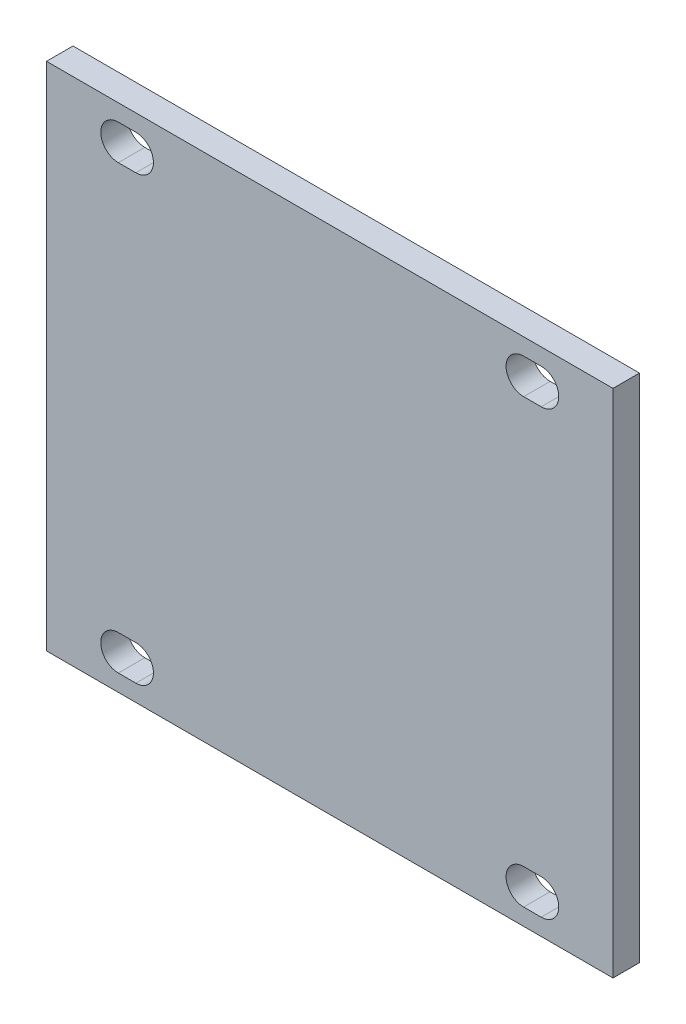
ISO-10303-21;
HEADER;
FILE_DESCRIPTION(('STEP AP214'),'2;1');
FILE_NAME('part.step','',(''),(''),'','','');
FILE_SCHEMA(('AUTOMOTIVE_DESIGN { 1 0 10303 214 1 1 1 1 }'));
ENDSEC;
DATA;
#1=APPLICATION_CONTEXT('core data for automotive mechanical design processes');
#2=APPLICATION_PROTOCOL_DEFINITION('international standard','automotive_design',2000,#1);
#3=PRODUCT_CONTEXT('',#1,'mechanical');
#4=PRODUCT('Part','Part','',(#3));
#5=PRODUCT_RELATED_PRODUCT_CATEGORY('part','',(#4));
#6=PRODUCT_DEFINITION_FORMATION('','',#4);
#7=PRODUCT_DEFINITION_CONTEXT('part definition',#1,'design');
#8=PRODUCT_DEFINITION('design','',#6,#7);
#9=PRODUCT_DEFINITION_SHAPE('','',#8);
#10=(LENGTH_UNIT() NAMED_UNIT(*) SI_UNIT(.MILLI.,.METRE.));
#11=(NAMED_UNIT(*) PLANE_ANGLE_UNIT() SI_UNIT($,.RADIAN.));
#12=(NAMED_UNIT(*) SI_UNIT($,.STERADIAN.) SOLID_ANGLE_UNIT());
#13=UNCERTAINTY_MEASURE_WITH_UNIT(LENGTH_MEASURE(1.E-05),#10,'distance_accuracy_value','');
#14=(GEOMETRIC_REPRESENTATION_CONTEXT(3) GLOBAL_UNCERTAINTY_ASSIGNED_CONTEXT((#13)) GLOBAL_UNIT_ASSIGNED_CONTEXT((#10,
#11,#12)) REPRESENTATION_CONTEXT('',''));
#15=CARTESIAN_POINT('',(0.,0.,0.));
#16=DIRECTION('',(0.,0.,1.));
#17=DIRECTION('',(1.,0.,0.));
#18=AXIS2_PLACEMENT_3D('',#15,#16,#17);
#19=CARTESIAN_POINT('',(0.,0.,0.));
#20=DIRECTION('',(0.,0.,-1.));
#21=DIRECTION('',(-1.,0.,0.));
#22=AXIS2_PLACEMENT_3D('',#19,#20,#21);
#23=PLANE('',#22);
#24=DIRECTION('',(0.,-1.,0.));
#25=VECTOR('',#24,1.);
#26=CARTESIAN_POINT('',(0.,0.,0.));
#27=LINE('',#26,#25);
#28=CARTESIAN_POINT('',(0.,32.,0.));
#29=VERTEX_POINT('',#28);
#30=CARTESIAN_POINT('',(0.,0.,0.));
#31=VERTEX_POINT('',#30);
#32=EDGE_CURVE('E366',#29,#31,#27,.T.);
#33=ORIENTED_EDGE('',*,*,#32,.F.);
#34=DIRECTION('',(-1.,0.,0.));
#35=VECTOR('',#34,1.);
#36=CARTESIAN_POINT('',(0.,32.,0.));
#37=LINE('',#36,#35);
#38=CARTESIAN_POINT('',(35.5,32.,0.));
#39=VERTEX_POINT('',#38);
#40=EDGE_CURVE('E373',#39,#29,#37,.T.);
#41=ORIENTED_EDGE('',*,*,#40,.F.);
#42=DIRECTION('',(0.,1.,0.));
#43=VECTOR('',#42,1.);
#44=CARTESIAN_POINT('',(35.5,0.,0.));
#45=LINE('',#44,#43);
#46=CARTESIAN_POINT('',(35.5,0.,0.));
#47=VERTEX_POINT('',#46);
#48=EDGE_CURVE('E383',#47,#39,#45,.T.);
#49=ORIENTED_EDGE('',*,*,#48,.F.);
#50=DIRECTION('',(1.,0.,0.));
#51=VECTOR('',#50,1.);
#52=CARTESIAN_POINT('',(0.,0.,0.));
#53=LINE('',#52,#51);
#54=EDGE_CURVE('E385',#31,#47,#53,.T.);
#55=ORIENTED_EDGE('',*,*,#54,.F.);
#56=EDGE_LOOP('',(#33,#41,#49,#55));
#57=FACE_BOUND('',#56,.T.);
#58=DIRECTION('',(-1.,0.,0.));
#59=VECTOR('',#58,1.);
#60=CARTESIAN_POINT('',(4.5,30.95,0.));
#61=LINE('',#60,#59);
#62=CARTESIAN_POINT('',(5.6,30.95,0.));
#63=VERTEX_POINT('',#62);
#64=CARTESIAN_POINT('',(4.5,30.95,0.));
#65=VERTEX_POINT('',#64);
#66=EDGE_CURVE('E342',#63,#65,#61,.T.);
#67=ORIENTED_EDGE('',*,*,#66,.T.);
#68=CARTESIAN_POINT('',(4.5,29.85,0.));
#69=DIRECTION('',(0.,0.,1.));
#70=DIRECTION('',(1.,0.,0.));
#71=AXIS2_PLACEMENT_3D('',#68,#69,#70);
#72=CIRCLE('',#71,1.1);
#73=CARTESIAN_POINT('',(4.5,28.75,0.));
#74=VERTEX_POINT('',#73);
#75=EDGE_CURVE('E340',#65,#74,#72,.T.);
#76=ORIENTED_EDGE('',*,*,#75,.T.);
#77=DIRECTION('',(1.,0.,0.));
#78=VECTOR('',#77,1.);
#79=CARTESIAN_POINT('',(4.5,28.75,0.));
#80=LINE('',#79,#78);
#81=CARTESIAN_POINT('',(5.6,28.75,0.));
#82=VERTEX_POINT('',#81);
#83=EDGE_CURVE('E352',#74,#82,#80,.T.);
#84=ORIENTED_EDGE('',*,*,#83,.T.);
#85=CARTESIAN_POINT('',(5.6,29.85,0.));
#86=DIRECTION('',(0.,0.,1.));
#87=DIRECTION('',(1.,0.,0.));
#88=AXIS2_PLACEMENT_3D('',#85,#86,#87);
#89=CIRCLE('',#88,1.1);
#90=EDGE_CURVE('E351',#82,#63,#89,.T.);
#91=ORIENTED_EDGE('',*,*,#90,.T.);
#92=EDGE_LOOP('',(#67,#76,#84,#91));
#93=FACE_BOUND('',#92,.T.);
#94=DIRECTION('',(-1.,0.,0.));
#95=VECTOR('',#94,1.);
#96=CARTESIAN_POINT('',(29.9,30.95,0.));
#97=LINE('',#96,#95);
#98=CARTESIAN_POINT('',(31.,30.95,0.));
#99=VERTEX_POINT('',#98);
#100=CARTESIAN_POINT('',(29.9,30.95,0.));
#101=VERTEX_POINT('',#100);
#102=EDGE_CURVE('E309',#99,#101,#97,.T.);
#103=ORIENTED_EDGE('',*,*,#102,.T.);
#104=CARTESIAN_POINT('',(29.9,29.85,0.));
#105=DIRECTION('',(0.,0.,1.));
#106=DIRECTION('',(1.,0.,0.));
#107=AXIS2_PLACEMENT_3D('',#104,#105,#106);
#108=CIRCLE('',#107,1.1);
#109=CARTESIAN_POINT('',(29.9,28.75,0.));
#110=VERTEX_POINT('',#109);
#111=EDGE_CURVE('E308',#101,#110,#108,.T.);
#112=ORIENTED_EDGE('',*,*,#111,.T.);
#113=DIRECTION('',(1.,0.,0.));
#114=VECTOR('',#113,1.);
#115=CARTESIAN_POINT('',(29.9,28.75,0.));
#116=LINE('',#115,#114);
#117=CARTESIAN_POINT('',(31.,28.75,0.));
#118=VERTEX_POINT('',#117);
#119=EDGE_CURVE('E319',#110,#118,#116,.T.);
#120=ORIENTED_EDGE('',*,*,#119,.T.);
#121=CARTESIAN_POINT('',(31.,29.85,0.));
#122=DIRECTION('',(0.,0.,1.));
#123=DIRECTION('',(1.,0.,0.));
#124=AXIS2_PLACEMENT_3D('',#121,#122,#123);
#125=CIRCLE('',#124,1.1);
#126=EDGE_CURVE('E323',#118,#99,#125,.T.);
#127=ORIENTED_EDGE('',*,*,#126,.T.);
#128=EDGE_LOOP('',(#103,#112,#120,#127));
#129=FACE_BOUND('',#128,.T.);
#130=DIRECTION('',(-1.,0.,0.));
#131=VECTOR('',#130,1.);
#132=CARTESIAN_POINT('',(29.9000000000003,3.25,0.));
#133=LINE('',#132,#131);
#134=CARTESIAN_POINT('',(31.0000000000003,3.25,0.));
#135=VERTEX_POINT('',#134);
#136=CARTESIAN_POINT('',(29.9000000000003,3.25,0.));
#137=VERTEX_POINT('',#136);
#138=EDGE_CURVE('E276',#135,#137,#133,.T.);
#139=ORIENTED_EDGE('',*,*,#138,.T.);
#140=CARTESIAN_POINT('',(29.9000000000003,2.15,0.));
#141=DIRECTION('',(0.,0.,1.));
#142=DIRECTION('',(1.,0.,0.));
#143=AXIS2_PLACEMENT_3D('',#140,#141,#142);
#144=CIRCLE('',#143,1.1);
#145=CARTESIAN_POINT('',(29.9000000000003,1.05,0.));
#146=VERTEX_POINT('',#145);
#147=EDGE_CURVE('E274',#137,#146,#144,.T.);
#148=ORIENTED_EDGE('',*,*,#147,.T.);
#149=DIRECTION('',(1.,0.,0.));
#150=VECTOR('',#149,1.);
#151=CARTESIAN_POINT('',(29.9000000000003,1.05,0.));
#152=LINE('',#151,#150);
#153=CARTESIAN_POINT('',(31.0000000000003,1.05,0.));
#154=VERTEX_POINT('',#153);
#155=EDGE_CURVE('E286',#146,#154,#152,.T.);
#156=ORIENTED_EDGE('',*,*,#155,.T.);
#157=CARTESIAN_POINT('',(31.0000000000003,2.15,0.));
#158=DIRECTION('',(0.,0.,1.));
#159=DIRECTION('',(1.,0.,0.));
#160=AXIS2_PLACEMENT_3D('',#157,#158,#159);
#161=CIRCLE('',#160,1.1);
#162=EDGE_CURVE('E295',#154,#135,#161,.T.);
#163=ORIENTED_EDGE('',*,*,#162,.T.);
#164=EDGE_LOOP('',(#139,#148,#156,#163));
#165=FACE_BOUND('',#164,.T.);
#166=DIRECTION('',(-1.,0.,0.));
#167=VECTOR('',#166,1.);
#168=CARTESIAN_POINT('',(4.50000000000029,3.25,0.));
#169=LINE('',#168,#167);
#170=CARTESIAN_POINT('',(5.60000000000029,3.25,0.));
#171=VERTEX_POINT('',#170);
#172=CARTESIAN_POINT('',(4.50000000000029,3.25,0.));
#173=VERTEX_POINT('',#172);
#174=EDGE_CURVE('E248',#171,#173,#169,.T.);
#175=ORIENTED_EDGE('',*,*,#174,.T.);
#176=CARTESIAN_POINT('',(4.50000000000029,2.15,0.));
#177=DIRECTION('',(0.,0.,1.));
#178=DIRECTION('',(1.,0.,0.));
#179=AXIS2_PLACEMENT_3D('',#176,#177,#178);
#180=CIRCLE('',#179,1.1);
#181=CARTESIAN_POINT('',(4.50000000000029,1.05,0.));
#182=VERTEX_POINT('',#181);
#183=EDGE_CURVE('E244',#173,#182,#180,.T.);
#184=ORIENTED_EDGE('',*,*,#183,.T.);
#185=DIRECTION('',(1.,0.,0.));
#186=VECTOR('',#185,1.);
#187=CARTESIAN_POINT('',(4.50000000000029,1.05,0.));
#188=LINE('',#187,#186);
#189=CARTESIAN_POINT('',(5.60000000000029,1.05,0.));
#190=VERTEX_POINT('',#189);
#191=EDGE_CURVE('E259',#182,#190,#188,.T.);
#192=ORIENTED_EDGE('',*,*,#191,.T.);
#193=CARTESIAN_POINT('',(5.60000000000029,2.15,0.));
#194=DIRECTION('',(0.,0.,1.));
#195=DIRECTION('',(1.,0.,0.));
#196=AXIS2_PLACEMENT_3D('',#193,#194,#195);
#197=CIRCLE('',#196,1.1);
#198=EDGE_CURVE('E265',#190,#171,#197,.T.);
#199=ORIENTED_EDGE('',*,*,#198,.T.);
#200=EDGE_LOOP('',(#175,#184,#192,#199));
#201=FACE_BOUND('',#200,.T.);
#202=DIRECTION('',(1.,0.,0.));
#203=VECTOR('',#202,1.);
#204=CARTESIAN_POINT('',(33.41,10.24,0.));
#205=LINE('',#204,#203);
#206=CARTESIAN_POINT('',(2.09,10.24,0.));
#207=VERTEX_POINT('',#206);
#208=CARTESIAN_POINT('',(33.41,10.24,0.));
#209=VERTEX_POINT('',#208);
#210=EDGE_CURVE('E228',#207,#209,#205,.T.);
#211=ORIENTED_EDGE('',*,*,#210,.T.);
#212=DIRECTION('',(0.,1.,0.));
#213=VECTOR('',#212,1.);
#214=CARTESIAN_POINT('',(33.41,25.86,0.));
#215=LINE('',#214,#213);
#216=CARTESIAN_POINT('',(33.41,25.86,0.));
#217=VERTEX_POINT('',#216);
#218=EDGE_CURVE('E65',#209,#217,#215,.T.);
#219=ORIENTED_EDGE('',*,*,#218,.T.);
#220=DIRECTION('',(-1.,0.,0.));
#221=VECTOR('',#220,1.);
#222=CARTESIAN_POINT('',(33.41,25.86,0.));
#223=LINE('',#222,#221);
#224=CARTESIAN_POINT('',(2.08999999999999,25.86,0.));
#225=VERTEX_POINT('',#224);
#226=EDGE_CURVE('E213',#217,#225,#223,.T.);
#227=ORIENTED_EDGE('',*,*,#226,.T.);
#228=DIRECTION('',(0.,-1.,0.));
#229=VECTOR('',#228,1.);
#230=CARTESIAN_POINT('',(2.08999999999999,25.86,0.));
#231=LINE('',#230,#229);
#232=EDGE_CURVE('E234',#225,#207,#231,.T.);
#233=ORIENTED_EDGE('',*,*,#232,.T.);
#234=EDGE_LOOP('',(#211,#219,#227,#233));
#235=FACE_BOUND('',#234,.T.);
#236=ADVANCED_FACE('F50',(#57,#93,#129,#165,#201,#235),#23,.T.);
#237=CARTESIAN_POINT('',(0.,0.,1.66));
#238=DIRECTION('',(0.,0.,-1.));
#239=DIRECTION('',(-1.,0.,0.));
#240=AXIS2_PLACEMENT_3D('',#237,#238,#239);
#241=PLANE('',#240);
#242=CARTESIAN_POINT('',(29.9000000000003,2.15,1.66));
#243=DIRECTION('',(0.,0.,1.));
#244=DIRECTION('',(1.,0.,0.));
#245=AXIS2_PLACEMENT_3D('',#242,#243,#244);
#246=CIRCLE('',#245,1.1);
#247=CARTESIAN_POINT('',(29.9000000000003,3.25,1.66));
#248=VERTEX_POINT('',#247);
#249=CARTESIAN_POINT('',(29.9000000000003,1.05,1.66));
#250=VERTEX_POINT('',#249);
#251=EDGE_CURVE('E277',#248,#250,#246,.T.);
#252=ORIENTED_EDGE('',*,*,#251,.F.);
#253=DIRECTION('',(-1.,0.,0.));
#254=VECTOR('',#253,1.);
#255=CARTESIAN_POINT('',(29.9000000000003,3.25,1.66));
#256=LINE('',#255,#254);
#257=CARTESIAN_POINT('',(31.0000000000003,3.25,1.66));
#258=VERTEX_POINT('',#257);
#259=EDGE_CURVE('E281',#258,#248,#256,.T.);
#260=ORIENTED_EDGE('',*,*,#259,.F.);
#261=CARTESIAN_POINT('',(31.0000000000003,2.15,1.66));
#262=DIRECTION('',(0.,0.,1.));
#263=DIRECTION('',(1.,0.,0.));
#264=AXIS2_PLACEMENT_3D('',#261,#262,#263);
#265=CIRCLE('',#264,1.1);
#266=CARTESIAN_POINT('',(31.0000000000003,1.05,1.66));
#267=VERTEX_POINT('',#266);
#268=EDGE_CURVE('E282',#267,#258,#265,.T.);
#269=ORIENTED_EDGE('',*,*,#268,.F.);
#270=DIRECTION('',(1.,0.,0.));
#271=VECTOR('',#270,1.);
#272=CARTESIAN_POINT('',(29.9000000000003,1.05,1.66));
#273=LINE('',#272,#271);
#274=EDGE_CURVE('E279',#250,#267,#273,.T.);
#275=ORIENTED_EDGE('',*,*,#274,.F.);
#276=EDGE_LOOP('',(#252,#260,#269,#275));
#277=FACE_BOUND('',#276,.T.);
#278=CARTESIAN_POINT('',(4.5,29.85,1.66));
#279=DIRECTION('',(0.,0.,1.));
#280=DIRECTION('',(1.,0.,0.));
#281=AXIS2_PLACEMENT_3D('',#278,#279,#280);
#282=CIRCLE('',#281,1.1);
#283=CARTESIAN_POINT('',(4.5,30.95,1.66));
#284=VERTEX_POINT('',#283);
#285=CARTESIAN_POINT('',(4.5,28.75,1.66));
#286=VERTEX_POINT('',#285);
#287=EDGE_CURVE('E339',#284,#286,#282,.T.);
#288=ORIENTED_EDGE('',*,*,#287,.F.);
#289=DIRECTION('',(-1.,0.,0.));
#290=VECTOR('',#289,1.);
#291=CARTESIAN_POINT('',(4.5,30.95,1.66));
#292=LINE('',#291,#290);
#293=CARTESIAN_POINT('',(5.6,30.95,1.66));
#294=VERTEX_POINT('',#293);
#295=EDGE_CURVE('E347',#294,#284,#292,.T.);
#296=ORIENTED_EDGE('',*,*,#295,.F.);
#297=CARTESIAN_POINT('',(5.6,29.85,1.66));
#298=DIRECTION('',(0.,0.,1.));
#299=DIRECTION('',(1.,0.,0.));
#300=AXIS2_PLACEMENT_3D('',#297,#298,#299);
#301=CIRCLE('',#300,1.1);
#302=CARTESIAN_POINT('',(5.6,28.75,1.66));
#303=VERTEX_POINT('',#302);
#304=EDGE_CURVE('E344',#303,#294,#301,.T.);
#305=ORIENTED_EDGE('',*,*,#304,.F.);
#306=DIRECTION('',(1.,0.,0.));
#307=VECTOR('',#306,1.);
#308=CARTESIAN_POINT('',(4.5,28.75,1.66));
#309=LINE('',#308,#307);
#310=EDGE_CURVE('E338',#286,#303,#309,.T.);
#311=ORIENTED_EDGE('',*,*,#310,.F.);
#312=EDGE_LOOP('',(#288,#296,#305,#311));
#313=FACE_BOUND('',#312,.T.);
#314=DIRECTION('',(0.,-1.,0.));
#315=VECTOR('',#314,1.);
#316=CARTESIAN_POINT('',(0.,0.,1.66));
#317=LINE('',#316,#315);
#318=CARTESIAN_POINT('',(0.,32.,1.66));
#319=VERTEX_POINT('',#318);
#320=CARTESIAN_POINT('',(0.,0.,1.66));
#321=VERTEX_POINT('',#320);
#322=EDGE_CURVE('E369',#319,#321,#317,.T.);
#323=ORIENTED_EDGE('',*,*,#322,.T.);
#324=DIRECTION('',(1.,0.,0.));
#325=VECTOR('',#324,1.);
#326=CARTESIAN_POINT('',(0.,0.,1.66));
#327=LINE('',#326,#325);
#328=CARTESIAN_POINT('',(35.5,0.,1.66));
#329=VERTEX_POINT('',#328);
#330=EDGE_CURVE('E375',#321,#329,#327,.T.);
#331=ORIENTED_EDGE('',*,*,#330,.T.);
#332=DIRECTION('',(0.,1.,0.));
#333=VECTOR('',#332,1.);
#334=CARTESIAN_POINT('',(35.5,0.,1.66));
#335=LINE('',#334,#333);
#336=CARTESIAN_POINT('',(35.5,32.,1.66));
#337=VERTEX_POINT('',#336);
#338=EDGE_CURVE('E374',#329,#337,#335,.T.);
#339=ORIENTED_EDGE('',*,*,#338,.T.);
#340=DIRECTION('',(-1.,0.,0.));
#341=VECTOR('',#340,1.);
#342=CARTESIAN_POINT('',(0.,32.,1.66));
#343=LINE('',#342,#341);
#344=EDGE_CURVE('E380',#337,#319,#343,.T.);
#345=ORIENTED_EDGE('',*,*,#344,.T.);
#346=EDGE_LOOP('',(#323,#331,#339,#345));
#347=FACE_BOUND('',#346,.T.);
#348=CARTESIAN_POINT('',(29.9,29.85,1.66));
#349=DIRECTION('',(0.,0.,1.));
#350=DIRECTION('',(1.,0.,0.));
#351=AXIS2_PLACEMENT_3D('',#348,#349,#350);
#352=CIRCLE('',#351,1.1);
#353=CARTESIAN_POINT('',(29.9,30.95,1.66));
#354=VERTEX_POINT('',#353);
#355=CARTESIAN_POINT('',(29.9,28.75,1.66));
#356=VERTEX_POINT('',#355);
#357=EDGE_CURVE('E307',#354,#356,#352,.T.);
#358=ORIENTED_EDGE('',*,*,#357,.F.);
#359=DIRECTION('',(-1.,0.,0.));
#360=VECTOR('',#359,1.);
#361=CARTESIAN_POINT('',(29.9,30.95,1.66));
#362=LINE('',#361,#360);
#363=CARTESIAN_POINT('',(31.,30.95,1.66));
#364=VERTEX_POINT('',#363);
#365=EDGE_CURVE('E312',#364,#354,#362,.T.);
#366=ORIENTED_EDGE('',*,*,#365,.F.);
#367=CARTESIAN_POINT('',(31.,29.85,1.66));
#368=DIRECTION('',(0.,0.,1.));
#369=DIRECTION('',(1.,0.,0.));
#370=AXIS2_PLACEMENT_3D('',#367,#368,#369);
#371=CIRCLE('',#370,1.1);
#372=CARTESIAN_POINT('',(31.,28.75,1.66));
#373=VERTEX_POINT('',#372);
#374=EDGE_CURVE('E315',#373,#364,#371,.T.);
#375=ORIENTED_EDGE('',*,*,#374,.F.);
#376=DIRECTION('',(1.,0.,0.));
#377=VECTOR('',#376,1.);
#378=CARTESIAN_POINT('',(29.9,28.75,1.66));
#379=LINE('',#378,#377);
#380=EDGE_CURVE('E310',#356,#373,#379,.T.);
#381=ORIENTED_EDGE('',*,*,#380,.F.);
#382=EDGE_LOOP('',(#358,#366,#375,#381));
#383=FACE_BOUND('',#382,.T.);
#384=CARTESIAN_POINT('',(4.50000000000029,2.15,1.66));
#385=DIRECTION('',(0.,0.,1.));
#386=DIRECTION('',(1.,0.,0.));
#387=AXIS2_PLACEMENT_3D('',#384,#385,#386);
#388=CIRCLE('',#387,1.1);
#389=CARTESIAN_POINT('',(4.50000000000029,3.25,1.66));
#390=VERTEX_POINT('',#389);
#391=CARTESIAN_POINT('',(4.50000000000029,1.05,1.66));
#392=VERTEX_POINT('',#391);
#393=EDGE_CURVE('E250',#390,#392,#388,.T.);
#394=ORIENTED_EDGE('',*,*,#393,.F.);
#395=DIRECTION('',(-1.,0.,0.));
#396=VECTOR('',#395,1.);
#397=CARTESIAN_POINT('',(4.50000000000029,3.25,1.66));
#398=LINE('',#397,#396);
#399=CARTESIAN_POINT('',(5.60000000000029,3.25,1.66));
#400=VERTEX_POINT('',#399);
#401=EDGE_CURVE('E255',#400,#390,#398,.T.);
#402=ORIENTED_EDGE('',*,*,#401,.F.);
#403=CARTESIAN_POINT('',(5.60000000000029,2.15,1.66));
#404=DIRECTION('',(0.,0.,1.));
#405=DIRECTION('',(1.,0.,0.));
#406=AXIS2_PLACEMENT_3D('',#403,#404,#405);
#407=CIRCLE('',#406,1.1);
#408=CARTESIAN_POINT('',(5.60000000000029,1.05,1.66));
#409=VERTEX_POINT('',#408);
#410=EDGE_CURVE('E252',#409,#400,#407,.T.);
#411=ORIENTED_EDGE('',*,*,#410,.F.);
#412=DIRECTION('',(1.,0.,0.));
#413=VECTOR('',#412,1.);
#414=CARTESIAN_POINT('',(4.50000000000029,1.05,1.66));
#415=LINE('',#414,#413);
#416=EDGE_CURVE('E246',#392,#409,#415,.T.);
#417=ORIENTED_EDGE('',*,*,#416,.F.);
#418=EDGE_LOOP('',(#394,#402,#411,#417));
#419=FACE_BOUND('',#418,.T.);
#420=ADVANCED_FACE('F412',(#277,#313,#347,#383,#419),#241,.F.);
#421=CARTESIAN_POINT('',(0.,0.,1.66));
#422=DIRECTION('',(1.,0.,0.));
#423=DIRECTION('',(0.,0.,-1.));
#424=AXIS2_PLACEMENT_3D('',#421,#422,#423);
#425=PLANE('',#424);
#426=ORIENTED_EDGE('',*,*,#32,.T.);
#427=DIRECTION('',(0.,0.,-1.));
#428=VECTOR('',#427,1.);
#429=CARTESIAN_POINT('',(0.,0.,1.66));
#430=LINE('',#429,#428);
#431=EDGE_CURVE('E11',#321,#31,#430,.T.);
#432=ORIENTED_EDGE('',*,*,#431,.F.);
#433=ORIENTED_EDGE('',*,*,#322,.F.);
#434=DIRECTION('',(0.,0.,-1.));
#435=VECTOR('',#434,1.);
#436=CARTESIAN_POINT('',(0.,32.,1.66));
#437=LINE('',#436,#435);
#438=EDGE_CURVE('E377',#319,#29,#437,.T.);
#439=ORIENTED_EDGE('',*,*,#438,.T.);
#440=EDGE_LOOP('',(#426,#432,#433,#439));
#441=FACE_BOUND('',#440,.T.);
#442=ADVANCED_FACE('F47',(#441),#425,.F.);
#443=CARTESIAN_POINT('',(0.,0.,1.66));
#444=DIRECTION('',(0.,1.,0.));
#445=DIRECTION('',(0.,0.,1.));
#446=AXIS2_PLACEMENT_3D('',#443,#444,#445);
#447=PLANE('',#446);
#448=ORIENTED_EDGE('',*,*,#54,.T.);
#449=DIRECTION('',(0.,0.,-1.));
#450=VECTOR('',#449,1.);
#451=CARTESIAN_POINT('',(35.5,0.,1.66));
#452=LINE('',#451,#450);
#453=EDGE_CURVE('E54',#329,#47,#452,.T.);
#454=ORIENTED_EDGE('',*,*,#453,.F.);
#455=ORIENTED_EDGE('',*,*,#330,.F.);
#456=ORIENTED_EDGE('',*,*,#431,.T.);
#457=EDGE_LOOP('',(#448,#454,#455,#456));
#458=FACE_BOUND('',#457,.T.);
#459=ADVANCED_FACE('F414',(#458),#447,.F.);
#460=CARTESIAN_POINT('',(35.5,0.,1.66));
#461=DIRECTION('',(-1.,0.,0.));
#462=DIRECTION('',(0.,0.,1.));
#463=AXIS2_PLACEMENT_3D('',#460,#461,#462);
#464=PLANE('',#463);
#465=ORIENTED_EDGE('',*,*,#48,.T.);
#466=DIRECTION('',(0.,0.,-1.));
#467=VECTOR('',#466,1.);
#468=CARTESIAN_POINT('',(35.5,32.,1.66));
#469=LINE('',#468,#467);
#470=EDGE_CURVE('E386',#337,#39,#469,.T.);
#471=ORIENTED_EDGE('',*,*,#470,.F.);
#472=ORIENTED_EDGE('',*,*,#338,.F.);
#473=ORIENTED_EDGE('',*,*,#453,.T.);
#474=EDGE_LOOP('',(#465,#471,#472,#473));
#475=FACE_BOUND('',#474,.T.);
#476=ADVANCED_FACE('F397',(#475),#464,.F.);
#477=CARTESIAN_POINT('',(0.,32.,1.66));
#478=DIRECTION('',(0.,-1.,0.));
#479=DIRECTION('',(0.,0.,-1.));
#480=AXIS2_PLACEMENT_3D('',#477,#478,#479);
#481=PLANE('',#480);
#482=ORIENTED_EDGE('',*,*,#40,.T.);
#483=ORIENTED_EDGE('',*,*,#438,.F.);
#484=ORIENTED_EDGE('',*,*,#344,.F.);
#485=ORIENTED_EDGE('',*,*,#470,.T.);
#486=EDGE_LOOP('',(#482,#483,#484,#485));
#487=FACE_BOUND('',#486,.T.);
#488=ADVANCED_FACE('F403',(#487),#481,.F.);
#489=CARTESIAN_POINT('',(4.5,29.85,1.66));
#490=DIRECTION('',(0.,0.,-1.));
#491=DIRECTION('',(-1.,0.,0.));
#492=AXIS2_PLACEMENT_3D('',#489,#490,#491);
#493=CYLINDRICAL_SURFACE('',#492,1.1);
#494=ORIENTED_EDGE('',*,*,#75,.F.);
#495=DIRECTION('',(0.,0.,-1.));
#496=VECTOR('',#495,1.);
#497=CARTESIAN_POINT('',(4.5,30.95,1.66));
#498=LINE('',#497,#496);
#499=EDGE_CURVE('E346',#284,#65,#498,.T.);
#500=ORIENTED_EDGE('',*,*,#499,.F.);
#501=ORIENTED_EDGE('',*,*,#287,.T.);
#502=DIRECTION('',(0.,0.,-1.));
#503=VECTOR('',#502,1.);
#504=CARTESIAN_POINT('',(4.5,28.75,1.66));
#505=LINE('',#504,#503);
#506=EDGE_CURVE('E364',#286,#74,#505,.T.);
#507=ORIENTED_EDGE('',*,*,#506,.T.);
#508=EDGE_LOOP('',(#494,#500,#501,#507));
#509=FACE_BOUND('',#508,.T.);
#510=ADVANCED_FACE('F435',(#509),#493,.F.);
#511=CARTESIAN_POINT('',(4.5,28.75,1.66));
#512=DIRECTION('',(0.,1.,0.));
#513=DIRECTION('',(0.,0.,1.));
#514=AXIS2_PLACEMENT_3D('',#511,#512,#513);
#515=PLANE('',#514);
#516=ORIENTED_EDGE('',*,*,#83,.F.);
#517=ORIENTED_EDGE('',*,*,#506,.F.);
#518=ORIENTED_EDGE('',*,*,#310,.T.);
#519=DIRECTION('',(0.,0.,-1.));
#520=VECTOR('',#519,1.);
#521=CARTESIAN_POINT('',(5.6,28.75,1.66));
#522=LINE('',#521,#520);
#523=EDGE_CURVE('E361',#303,#82,#522,.T.);
#524=ORIENTED_EDGE('',*,*,#523,.T.);
#525=EDGE_LOOP('',(#516,#517,#518,#524));
#526=FACE_BOUND('',#525,.T.);
#527=ADVANCED_FACE('F436',(#526),#515,.T.);
#528=CARTESIAN_POINT('',(5.6,29.85,1.66));
#529=DIRECTION('',(0.,0.,-1.));
#530=DIRECTION('',(-1.,0.,0.));
#531=AXIS2_PLACEMENT_3D('',#528,#529,#530);
#532=CYLINDRICAL_SURFACE('',#531,1.1);
#533=ORIENTED_EDGE('',*,*,#90,.F.);
#534=ORIENTED_EDGE('',*,*,#523,.F.);
#535=ORIENTED_EDGE('',*,*,#304,.T.);
#536=DIRECTION('',(0.,0.,-1.));
#537=VECTOR('',#536,1.);
#538=CARTESIAN_POINT('',(5.6,30.95,1.66));
#539=LINE('',#538,#537);
#540=EDGE_CURVE('E363',#294,#63,#539,.T.);
#541=ORIENTED_EDGE('',*,*,#540,.T.);
#542=EDGE_LOOP('',(#533,#534,#535,#541));
#543=FACE_BOUND('',#542,.T.);
#544=ADVANCED_FACE('F442',(#543),#532,.F.);
#545=CARTESIAN_POINT('',(4.5,30.95,1.66));
#546=DIRECTION('',(0.,-1.,0.));
#547=DIRECTION('',(0.,0.,-1.));
#548=AXIS2_PLACEMENT_3D('',#545,#546,#547);
#549=PLANE('',#548);
#550=ORIENTED_EDGE('',*,*,#66,.F.);
#551=ORIENTED_EDGE('',*,*,#540,.F.);
#552=ORIENTED_EDGE('',*,*,#295,.T.);
#553=ORIENTED_EDGE('',*,*,#499,.T.);
#554=EDGE_LOOP('',(#550,#551,#552,#553));
#555=FACE_BOUND('',#554,.T.);
#556=ADVANCED_FACE('F450',(#555),#549,.T.);
#557=CARTESIAN_POINT('',(29.9,29.85,1.66));
#558=DIRECTION('',(0.,0.,-1.));
#559=DIRECTION('',(-1.,0.,0.));
#560=AXIS2_PLACEMENT_3D('',#557,#558,#559);
#561=CYLINDRICAL_SURFACE('',#560,1.1);
#562=ORIENTED_EDGE('',*,*,#111,.F.);
#563=DIRECTION('',(0.,0.,-1.));
#564=VECTOR('',#563,1.);
#565=CARTESIAN_POINT('',(29.9,30.95,1.66));
#566=LINE('',#565,#564);
#567=EDGE_CURVE('E320',#354,#101,#566,.T.);
#568=ORIENTED_EDGE('',*,*,#567,.F.);
#569=ORIENTED_EDGE('',*,*,#357,.T.);
#570=DIRECTION('',(0.,0.,-1.));
#571=VECTOR('',#570,1.);
#572=CARTESIAN_POINT('',(29.9,28.75,1.66));
#573=LINE('',#572,#571);
#574=EDGE_CURVE('E331',#356,#110,#573,.T.);
#575=ORIENTED_EDGE('',*,*,#574,.T.);
#576=EDGE_LOOP('',(#562,#568,#569,#575));
#577=FACE_BOUND('',#576,.T.);
#578=ADVANCED_FACE('F452',(#577),#561,.F.);
#579=CARTESIAN_POINT('',(29.9,28.75,1.66));
#580=DIRECTION('',(0.,1.,0.));
#581=DIRECTION('',(0.,0.,1.));
#582=AXIS2_PLACEMENT_3D('',#579,#580,#581);
#583=PLANE('',#582);
#584=ORIENTED_EDGE('',*,*,#119,.F.);
#585=ORIENTED_EDGE('',*,*,#574,.F.);
#586=ORIENTED_EDGE('',*,*,#380,.T.);
#587=DIRECTION('',(0.,0.,-1.));
#588=VECTOR('',#587,1.);
#589=CARTESIAN_POINT('',(31.,28.75,1.66));
#590=LINE('',#589,#588);
#591=EDGE_CURVE('E335',#373,#118,#590,.T.);
#592=ORIENTED_EDGE('',*,*,#591,.T.);
#593=EDGE_LOOP('',(#584,#585,#586,#592));
#594=FACE_BOUND('',#593,.T.);
#595=ADVANCED_FACE('F453',(#594),#583,.T.);
#596=CARTESIAN_POINT('',(31.,29.85,1.66));
#597=DIRECTION('',(0.,0.,-1.));
#598=DIRECTION('',(-1.,0.,0.));
#599=AXIS2_PLACEMENT_3D('',#596,#597,#598);
#600=CYLINDRICAL_SURFACE('',#599,1.1);
#601=ORIENTED_EDGE('',*,*,#126,.F.);
#602=ORIENTED_EDGE('',*,*,#591,.F.);
#603=ORIENTED_EDGE('',*,*,#374,.T.);
#604=DIRECTION('',(0.,0.,-1.));
#605=VECTOR('',#604,1.);
#606=CARTESIAN_POINT('',(31.,30.95,1.66));
#607=LINE('',#606,#605);
#608=EDGE_CURVE('E329',#364,#99,#607,.T.);
#609=ORIENTED_EDGE('',*,*,#608,.T.);
#610=EDGE_LOOP('',(#601,#602,#603,#609));
#611=FACE_BOUND('',#610,.T.);
#612=ADVANCED_FACE('F459',(#611),#600,.F.);
#613=CARTESIAN_POINT('',(29.9,30.95,1.66));
#614=DIRECTION('',(0.,-1.,0.));
#615=DIRECTION('',(0.,0.,-1.));
#616=AXIS2_PLACEMENT_3D('',#613,#614,#615);
#617=PLANE('',#616);
#618=ORIENTED_EDGE('',*,*,#102,.F.);
#619=ORIENTED_EDGE('',*,*,#608,.F.);
#620=ORIENTED_EDGE('',*,*,#365,.T.);
#621=ORIENTED_EDGE('',*,*,#567,.T.);
#622=EDGE_LOOP('',(#618,#619,#620,#621));
#623=FACE_BOUND('',#622,.T.);
#624=ADVANCED_FACE('F464',(#623),#617,.T.);
#625=CARTESIAN_POINT('',(29.9000000000003,2.15,1.66));
#626=DIRECTION('',(0.,0.,-1.));
#627=DIRECTION('',(-1.,0.,0.));
#628=AXIS2_PLACEMENT_3D('',#625,#626,#627);
#629=CYLINDRICAL_SURFACE('',#628,1.1);
#630=ORIENTED_EDGE('',*,*,#147,.F.);
#631=DIRECTION('',(0.,0.,-1.));
#632=VECTOR('',#631,1.);
#633=CARTESIAN_POINT('',(29.9000000000003,3.25,1.66));
#634=LINE('',#633,#632);
#635=EDGE_CURVE('E287',#248,#137,#634,.T.);
#636=ORIENTED_EDGE('',*,*,#635,.F.);
#637=ORIENTED_EDGE('',*,*,#251,.T.);
#638=DIRECTION('',(0.,0.,-1.));
#639=VECTOR('',#638,1.);
#640=CARTESIAN_POINT('',(29.9000000000003,1.05,1.66));
#641=LINE('',#640,#639);
#642=EDGE_CURVE('E304',#250,#146,#641,.T.);
#643=ORIENTED_EDGE('',*,*,#642,.T.);
#644=EDGE_LOOP('',(#630,#636,#637,#643));
#645=FACE_BOUND('',#644,.T.);
#646=ADVANCED_FACE('F470',(#645),#629,.F.);
#647=CARTESIAN_POINT('',(29.9000000000003,1.05,1.66));
#648=DIRECTION('',(0.,1.,0.));
#649=DIRECTION('',(0.,0.,1.));
#650=AXIS2_PLACEMENT_3D('',#647,#648,#649);
#651=PLANE('',#650);
#652=ORIENTED_EDGE('',*,*,#155,.F.);
#653=ORIENTED_EDGE('',*,*,#642,.F.);
#654=ORIENTED_EDGE('',*,*,#274,.T.);
#655=DIRECTION('',(0.,0.,-1.));
#656=VECTOR('',#655,1.);
#657=CARTESIAN_POINT('',(31.0000000000003,1.05,1.66));
#658=LINE('',#657,#656);
#659=EDGE_CURVE('E302',#267,#154,#658,.T.);
#660=ORIENTED_EDGE('',*,*,#659,.T.);
#661=EDGE_LOOP('',(#652,#653,#654,#660));
#662=FACE_BOUND('',#661,.T.);
#663=ADVANCED_FACE('F473',(#662),#651,.T.);
#664=CARTESIAN_POINT('',(31.0000000000003,2.15,1.66));
#665=DIRECTION('',(0.,0.,-1.));
#666=DIRECTION('',(-1.,0.,0.));
#667=AXIS2_PLACEMENT_3D('',#664,#665,#666);
#668=CYLINDRICAL_SURFACE('',#667,1.1);
#669=ORIENTED_EDGE('',*,*,#162,.F.);
#670=ORIENTED_EDGE('',*,*,#659,.F.);
#671=ORIENTED_EDGE('',*,*,#268,.T.);
#672=DIRECTION('',(0.,0.,-1.));
#673=VECTOR('',#672,1.);
#674=CARTESIAN_POINT('',(31.0000000000003,3.25,1.66));
#675=LINE('',#674,#673);
#676=EDGE_CURVE('E296',#258,#135,#675,.T.);
#677=ORIENTED_EDGE('',*,*,#676,.T.);
#678=EDGE_LOOP('',(#669,#670,#671,#677));
#679=FACE_BOUND('',#678,.T.);
#680=ADVANCED_FACE('F474',(#679),#668,.F.);
#681=CARTESIAN_POINT('',(29.9000000000003,3.25,1.66));
#682=DIRECTION('',(0.,-1.,0.));
#683=DIRECTION('',(0.,0.,-1.));
#684=AXIS2_PLACEMENT_3D('',#681,#682,#683);
#685=PLANE('',#684);
#686=ORIENTED_EDGE('',*,*,#138,.F.);
#687=ORIENTED_EDGE('',*,*,#676,.F.);
#688=ORIENTED_EDGE('',*,*,#259,.T.);
#689=ORIENTED_EDGE('',*,*,#635,.T.);
#690=EDGE_LOOP('',(#686,#687,#688,#689));
#691=FACE_BOUND('',#690,.T.);
#692=ADVANCED_FACE('F479',(#691),#685,.T.);
#693=CARTESIAN_POINT('',(4.50000000000029,2.15,1.66));
#694=DIRECTION('',(0.,0.,-1.));
#695=DIRECTION('',(-1.,0.,0.));
#696=AXIS2_PLACEMENT_3D('',#693,#694,#695);
#697=CYLINDRICAL_SURFACE('',#696,1.1);
#698=ORIENTED_EDGE('',*,*,#183,.F.);
#699=DIRECTION('',(0.,0.,-1.));
#700=VECTOR('',#699,1.);
#701=CARTESIAN_POINT('',(4.50000000000029,3.25,1.66));
#702=LINE('',#701,#700);
#703=EDGE_CURVE('E258',#390,#173,#702,.T.);
#704=ORIENTED_EDGE('',*,*,#703,.F.);
#705=ORIENTED_EDGE('',*,*,#393,.T.);
#706=DIRECTION('',(0.,0.,-1.));
#707=VECTOR('',#706,1.);
#708=CARTESIAN_POINT('',(4.50000000000029,1.05,1.66));
#709=LINE('',#708,#707);
#710=EDGE_CURVE('E275',#392,#182,#709,.T.);
#711=ORIENTED_EDGE('',*,*,#710,.T.);
#712=EDGE_LOOP('',(#698,#704,#705,#711));
#713=FACE_BOUND('',#712,.T.);
#714=ADVANCED_FACE('F483',(#713),#697,.F.);
#715=CARTESIAN_POINT('',(4.50000000000029,1.05,1.66));
#716=DIRECTION('',(0.,1.,0.));
#717=DIRECTION('',(0.,0.,1.));
#718=AXIS2_PLACEMENT_3D('',#715,#716,#717);
#719=PLANE('',#718);
#720=ORIENTED_EDGE('',*,*,#191,.F.);
#721=ORIENTED_EDGE('',*,*,#710,.F.);
#722=ORIENTED_EDGE('',*,*,#416,.T.);
#723=DIRECTION('',(0.,0.,-1.));
#724=VECTOR('',#723,1.);
#725=CARTESIAN_POINT('',(5.60000000000029,1.05,1.66));
#726=LINE('',#725,#724);
#727=EDGE_CURVE('E269',#409,#190,#726,.T.);
#728=ORIENTED_EDGE('',*,*,#727,.T.);
#729=EDGE_LOOP('',(#720,#721,#722,#728));
#730=FACE_BOUND('',#729,.T.);
#731=ADVANCED_FACE('F490',(#730),#719,.T.);
#732=CARTESIAN_POINT('',(5.60000000000029,2.15,1.66));
#733=DIRECTION('',(0.,0.,-1.));
#734=DIRECTION('',(-1.,0.,0.));
#735=AXIS2_PLACEMENT_3D('',#732,#733,#734);
#736=CYLINDRICAL_SURFACE('',#735,1.1);
#737=ORIENTED_EDGE('',*,*,#198,.F.);
#738=ORIENTED_EDGE('',*,*,#727,.F.);
#739=ORIENTED_EDGE('',*,*,#410,.T.);
#740=DIRECTION('',(0.,0.,-1.));
#741=VECTOR('',#740,1.);
#742=CARTESIAN_POINT('',(5.60000000000029,3.25,1.66));
#743=LINE('',#742,#741);
#744=EDGE_CURVE('E68',#400,#171,#743,.T.);
#745=ORIENTED_EDGE('',*,*,#744,.T.);
#746=EDGE_LOOP('',(#737,#738,#739,#745));
#747=FACE_BOUND('',#746,.T.);
#748=ADVANCED_FACE('F491',(#747),#736,.F.);
#749=CARTESIAN_POINT('',(4.50000000000029,3.25,1.66));
#750=DIRECTION('',(0.,-1.,0.));
#751=DIRECTION('',(0.,0.,-1.));
#752=AXIS2_PLACEMENT_3D('',#749,#750,#751);
#753=PLANE('',#752);
#754=ORIENTED_EDGE('',*,*,#174,.F.);
#755=ORIENTED_EDGE('',*,*,#744,.F.);
#756=ORIENTED_EDGE('',*,*,#401,.T.);
#757=ORIENTED_EDGE('',*,*,#703,.T.);
#758=EDGE_LOOP('',(#754,#755,#756,#757));
#759=FACE_BOUND('',#758,.T.);
#760=ADVANCED_FACE('F494',(#759),#753,.T.);
#761=CARTESIAN_POINT('',(33.41,25.86,-1.));
#762=DIRECTION('',(1.,0.,0.));
#763=DIRECTION('',(0.,0.,-1.));
#764=AXIS2_PLACEMENT_3D('',#761,#762,#763);
#765=PLANE('',#764);
#766=ORIENTED_EDGE('',*,*,#218,.F.);
#767=DIRECTION('',(0.,0.,1.));
#768=VECTOR('',#767,1.);
#769=CARTESIAN_POINT('',(33.41,10.24,-1.));
#770=LINE('',#769,#768);
#771=CARTESIAN_POINT('',(33.41,10.24,-1.));
#772=VERTEX_POINT('',#771);
#773=EDGE_CURVE('E226',#772,#209,#770,.T.);
#774=ORIENTED_EDGE('',*,*,#773,.F.);
#775=DIRECTION('',(0.,1.,0.));
#776=VECTOR('',#775,1.);
#777=CARTESIAN_POINT('',(33.41,25.86,-1.));
#778=LINE('',#777,#776);
#779=CARTESIAN_POINT('',(33.41,25.86,-1.));
#780=VERTEX_POINT('',#779);
#781=EDGE_CURVE('E224',#772,#780,#778,.T.);
#782=ORIENTED_EDGE('',*,*,#781,.T.);
#783=DIRECTION('',(0.,0.,1.));
#784=VECTOR('',#783,1.);
#785=CARTESIAN_POINT('',(33.41,25.86,-1.));
#786=LINE('',#785,#784);
#787=EDGE_CURVE('E208',#780,#217,#786,.T.);
#788=ORIENTED_EDGE('',*,*,#787,.T.);
#789=EDGE_LOOP('',(#766,#774,#782,#788));
#790=FACE_BOUND('',#789,.T.);
#791=ADVANCED_FACE('F229',(#790),#765,.T.);
#792=CARTESIAN_POINT('',(33.41,10.24,-1.));
#793=DIRECTION('',(0.,-1.,0.));
#794=DIRECTION('',(1.,0.,0.));
#795=AXIS2_PLACEMENT_3D('',#792,#793,#794);
#796=PLANE('',#795);
#797=ORIENTED_EDGE('',*,*,#210,.F.);
#798=DIRECTION('',(0.,0.,1.));
#799=VECTOR('',#798,1.);
#800=CARTESIAN_POINT('',(2.09,10.24,-1.));
#801=LINE('',#800,#799);
#802=CARTESIAN_POINT('',(2.09,10.24,-1.));
#803=VERTEX_POINT('',#802);
#804=EDGE_CURVE('E241',#803,#207,#801,.T.);
#805=ORIENTED_EDGE('',*,*,#804,.F.);
#806=DIRECTION('',(1.,0.,0.));
#807=VECTOR('',#806,1.);
#808=CARTESIAN_POINT('',(33.41,10.24,-1.));
#809=LINE('',#808,#807);
#810=EDGE_CURVE('E216',#803,#772,#809,.T.);
#811=ORIENTED_EDGE('',*,*,#810,.T.);
#812=ORIENTED_EDGE('',*,*,#773,.T.);
#813=EDGE_LOOP('',(#797,#805,#811,#812));
#814=FACE_BOUND('',#813,.T.);
#815=ADVANCED_FACE('F498',(#814),#796,.T.);
#816=CARTESIAN_POINT('',(2.08999999999999,25.86,-1.));
#817=DIRECTION('',(-1.,0.,0.));
#818=DIRECTION('',(0.,-1.,0.));
#819=AXIS2_PLACEMENT_3D('',#816,#817,#818);
#820=PLANE('',#819);
#821=ORIENTED_EDGE('',*,*,#232,.F.);
#822=DIRECTION('',(0.,0.,1.));
#823=VECTOR('',#822,1.);
#824=CARTESIAN_POINT('',(2.08999999999999,25.86,-1.));
#825=LINE('',#824,#823);
#826=CARTESIAN_POINT('',(2.08999999999999,25.86,-1.));
#827=VERTEX_POINT('',#826);
#828=EDGE_CURVE('E214',#827,#225,#825,.T.);
#829=ORIENTED_EDGE('',*,*,#828,.F.);
#830=DIRECTION('',(0.,-1.,0.));
#831=VECTOR('',#830,1.);
#832=CARTESIAN_POINT('',(2.08999999999999,25.86,-1.));
#833=LINE('',#832,#831);
#834=EDGE_CURVE('E227',#827,#803,#833,.T.);
#835=ORIENTED_EDGE('',*,*,#834,.T.);
#836=ORIENTED_EDGE('',*,*,#804,.T.);
#837=EDGE_LOOP('',(#821,#829,#835,#836));
#838=FACE_BOUND('',#837,.T.);
#839=ADVANCED_FACE('F504',(#838),#820,.T.);
#840=CARTESIAN_POINT('',(33.41,25.86,-1.));
#841=DIRECTION('',(0.,1.,0.));
#842=DIRECTION('',(-1.,0.,0.));
#843=AXIS2_PLACEMENT_3D('',#840,#841,#842);
#844=PLANE('',#843);
#845=ORIENTED_EDGE('',*,*,#226,.F.);
#846=ORIENTED_EDGE('',*,*,#787,.F.);
#847=DIRECTION('',(-1.,0.,0.));
#848=VECTOR('',#847,1.);
#849=CARTESIAN_POINT('',(33.41,25.86,-1.));
#850=LINE('',#849,#848);
#851=EDGE_CURVE('E211',#780,#827,#850,.T.);
#852=ORIENTED_EDGE('',*,*,#851,.T.);
#853=ORIENTED_EDGE('',*,*,#828,.T.);
#854=EDGE_LOOP('',(#845,#846,#852,#853));
#855=FACE_BOUND('',#854,.T.);
#856=ADVANCED_FACE('F209',(#855),#844,.T.);
#857=CARTESIAN_POINT('',(0.,0.,-1.));
#858=DIRECTION('',(0.,0.,-1.));
#859=DIRECTION('',(-1.,0.,0.));
#860=AXIS2_PLACEMENT_3D('',#857,#858,#859);
#861=PLANE('',#860);
#862=ORIENTED_EDGE('',*,*,#781,.F.);
#863=ORIENTED_EDGE('',*,*,#810,.F.);
#864=ORIENTED_EDGE('',*,*,#834,.F.);
#865=ORIENTED_EDGE('',*,*,#851,.F.);
#866=EDGE_LOOP('',(#862,#863,#864,#865));
#867=FACE_BOUND('',#866,.T.);
#868=ADVANCED_FACE('F222',(#867),#861,.T.);
#869=CLOSED_SHELL('',(#236,#420,#442,#459,#476,#488,#510,#527,#544,#556,#578,#595,#612,#624,
#646,#663,#680,#692,#714,#731,#748,#760,#791,#815,#839,#856,#868));
#870=MANIFOLD_SOLID_BREP('B2',#869);
#871=ADVANCED_BREP_SHAPE_REPRESENTATION('',(#18,#870),#14);
#872=SHAPE_DEFINITION_REPRESENTATION(#9,#871);
ENDSEC;
END-ISO-10303-21;
